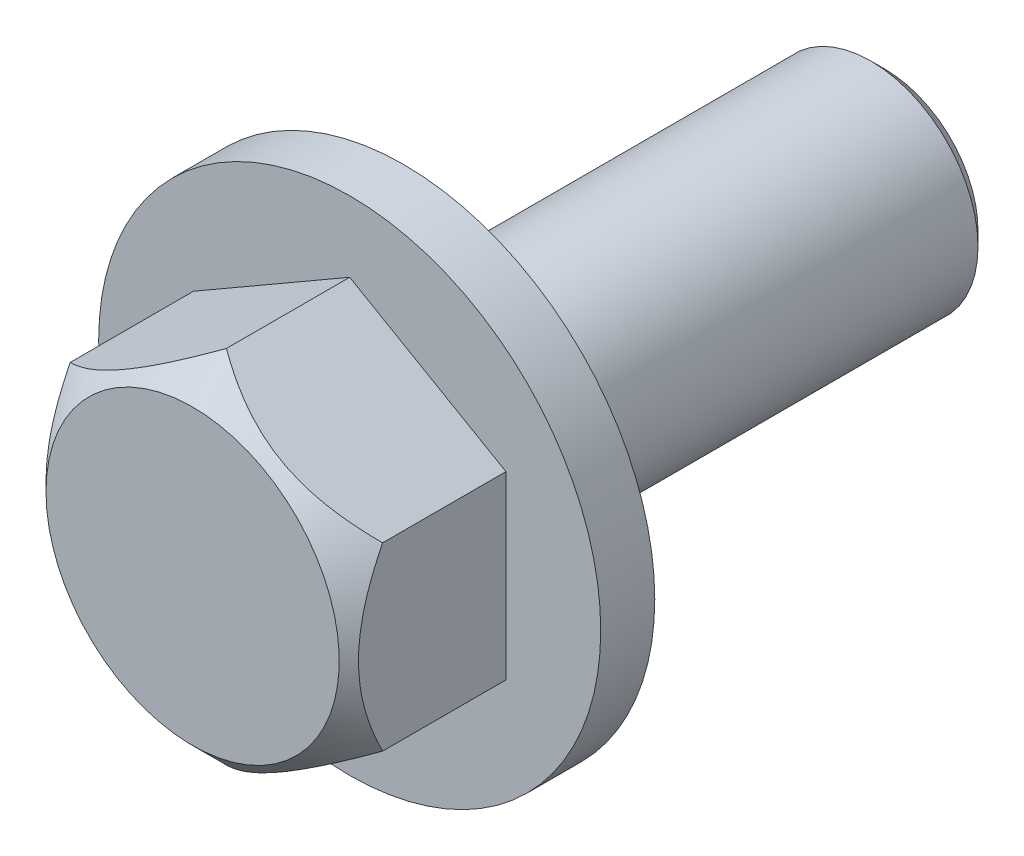
ISO-10303-21;
HEADER;
FILE_DESCRIPTION(('STEP AP214'),'2;1');
FILE_NAME('part.step','',(''),(''),'','','');
FILE_SCHEMA(('AUTOMOTIVE_DESIGN { 1 0 10303 214 1 1 1 1 }'));
ENDSEC;
DATA;
#1=APPLICATION_CONTEXT('core data for automotive mechanical design processes');
#2=APPLICATION_PROTOCOL_DEFINITION('international standard','automotive_design',2000,#1);
#3=PRODUCT_CONTEXT('',#1,'mechanical');
#4=PRODUCT('Part','Part','',(#3));
#5=PRODUCT_RELATED_PRODUCT_CATEGORY('part','',(#4));
#6=PRODUCT_DEFINITION_FORMATION('','',#4);
#7=PRODUCT_DEFINITION_CONTEXT('part definition',#1,'design');
#8=PRODUCT_DEFINITION('design','',#6,#7);
#9=PRODUCT_DEFINITION_SHAPE('','',#8);
#10=(LENGTH_UNIT() NAMED_UNIT(*) SI_UNIT(.MILLI.,.METRE.));
#11=(NAMED_UNIT(*) PLANE_ANGLE_UNIT() SI_UNIT($,.RADIAN.));
#12=(NAMED_UNIT(*) SI_UNIT($,.STERADIAN.) SOLID_ANGLE_UNIT());
#13=UNCERTAINTY_MEASURE_WITH_UNIT(LENGTH_MEASURE(1.E-05),#10,'distance_accuracy_value','');
#14=(GEOMETRIC_REPRESENTATION_CONTEXT(3) GLOBAL_UNCERTAINTY_ASSIGNED_CONTEXT((#13)) GLOBAL_UNIT_ASSIGNED_CONTEXT((#10,
#11,#12)) REPRESENTATION_CONTEXT('',''));
#15=CARTESIAN_POINT('',(0.,0.,0.));
#16=DIRECTION('',(0.,0.,1.));
#17=DIRECTION('',(1.,0.,0.));
#18=AXIS2_PLACEMENT_3D('',#15,#16,#17);
#19=CARTESIAN_POINT('',(9.25,5.34048999000404,9.3));
#20=DIRECTION('',(-0.5,-0.866025403784439,0.));
#21=DIRECTION('',(0.866025403784439,-0.5,0.));
#22=AXIS2_PLACEMENT_3D('',#19,#20,#21);
#23=PLANE('',#22);
#24=DIRECTION('',(0.,0.,-1.));
#25=VECTOR('',#24,1.);
#26=CARTESIAN_POINT('',(0.,10.6809799800081,9.3));
#27=LINE('',#26,#25);
#28=CARTESIAN_POINT('',(0.,10.6809799800081,7.3));
#29=VERTEX_POINT('',#28);
#30=CARTESIAN_POINT('',(0.,10.6809799800081,0.));
#31=VERTEX_POINT('',#30);
#32=EDGE_CURVE('E11',#29,#31,#27,.T.);
#33=ORIENTED_EDGE('',*,*,#32,.F.);
#34=CARTESIAN_POINT('',(-0.000199999999999625,10.6810954500619,7.2998845280737));
#35=CARTESIAN_POINT('',(0.158829174706491,10.5892799132361,7.39168718876653));
#36=CARTESIAN_POINT('',(0.31910380653289,10.4967453114069,7.48068854532498));
#37=CARTESIAN_POINT('',(0.642337852399902,10.3101260480143,7.65219880633447));
#38=CARTESIAN_POINT('',(0.805298674777847,10.216040573347,7.73470416502706));
#39=CARTESIAN_POINT('',(1.1348676092499,10.0257638603131,7.89268200351056));
#40=CARTESIAN_POINT('',(1.30149126236441,9.92956364933404,7.96811150950248));
#41=CARTESIAN_POINT('',(1.63747531263137,9.73558316746899,8.11029937459871));
#42=CARTESIAN_POINT('',(1.80683528690596,9.63780314073161,8.17705905941547));
#43=CARTESIAN_POINT('',(2.14556892319104,9.44223518463884,8.29979498305546));
#44=CARTESIAN_POINT('',(2.31490095825739,9.34447128861085,8.35592352165215));
#45=CARTESIAN_POINT('',(2.65593877344325,9.14757301420945,8.45753910479698));
#46=CARTESIAN_POINT('',(2.82764429589576,9.04843878460015,8.50302729500586));
#47=CARTESIAN_POINT('',(3.17269464729332,8.8492238713368,8.58221696358148));
#48=CARTESIAN_POINT('',(3.34603486826237,8.74914584809893,8.6159449728134));
#49=CARTESIAN_POINT('',(3.69417056108437,8.54814961213363,8.67087314748344));
#50=CARTESIAN_POINT('',(3.86896581151441,8.44723152724478,8.69207518498653));
#51=CARTESIAN_POINT('',(4.29492619104381,8.20130318745936,8.72762496747268));
#52=CARTESIAN_POINT('',(4.54655172248353,8.05602711914766,8.73508511778484));
#53=CARTESIAN_POINT('',(5.04934771228823,7.76573771908645,8.72256376339598));
#54=CARTESIAN_POINT('',(5.30051798024096,7.62072449727151,8.70257263961371));
#55=CARTESIAN_POINT('',(5.80049086438446,7.33206501802375,8.63632872486491));
#56=CARTESIAN_POINT('',(6.0492905161681,7.18842047209218,8.59004656765804));
#57=CARTESIAN_POINT('',(6.5426134329192,6.90360035330852,8.4737363370328));
#58=CARTESIAN_POINT('',(6.78713702430313,6.76242459199979,8.403710084533));
#59=CARTESIAN_POINT('',(7.22120022201972,6.51181808795281,8.25964812915158));
#60=CARTESIAN_POINT('',(7.41170116585497,6.40183231674865,8.18940192943167));
#61=CARTESIAN_POINT('',(7.78928351087732,6.18383504820875,8.03759012684629));
#62=CARTESIAN_POINT('',(7.97636480837184,6.07582361073994,7.95602418137893));
#63=CARTESIAN_POINT('',(8.34651860826112,5.8621152147323,7.7834011605929));
#64=CARTESIAN_POINT('',(8.52960163781837,5.75641217833337,7.69237393377003));
#65=CARTESIAN_POINT('',(8.89237769430114,5.54696332446749,7.50202330421582));
#66=CARTESIAN_POINT('',(9.07207271807039,5.44321635412228,7.40270498823749));
#67=CARTESIAN_POINT('',(9.25019999999999,5.3403745199502,7.2998845280737));
#68=B_SPLINE_CURVE_WITH_KNOTS('',3,(#34,#35,#36,#37,#38,#39,#40,#41,#42,#43,#44,#45,#46,#47,#48,
#49,#50,#51,#52,#53,#54,#55,#56,#57,#58,#59,#60,#61,#62,#63,#64,#65,#66,#67),.UNSPECIFIED.,.F.,
.F.,(4,2,2,2,2,2,2,2,2,2,2,2,2,2,2,2,4),(0.,0.615926148952828,1.23218619568639,1.85197482577676,
2.47166857139587,3.08167196465218,3.69160964775171,4.3001622758662,4.90862392992529,
5.77920863985932,6.6500984854427,7.52196300514645,8.39376067726823,9.08618244548536,
9.77862517501767,10.468946126611,11.1588466217033),.UNSPECIFIED.);
#69=CARTESIAN_POINT('',(9.25,5.34048999000405,7.3));
#70=VERTEX_POINT('',#69);
#71=EDGE_CURVE('E116',#29,#70,#68,.T.);
#72=ORIENTED_EDGE('',*,*,#71,.T.);
#73=DIRECTION('',(0.,0.,-1.));
#74=VECTOR('',#73,1.);
#75=CARTESIAN_POINT('',(9.25,5.34048999000404,9.3));
#76=LINE('',#75,#74);
#77=CARTESIAN_POINT('',(9.25,5.34048999000404,0.));
#78=VERTEX_POINT('',#77);
#79=EDGE_CURVE('E113',#70,#78,#76,.T.);
#80=ORIENTED_EDGE('',*,*,#79,.T.);
#81=DIRECTION('',(-0.866025403784439,0.5,0.));
#82=VECTOR('',#81,1.);
#83=CARTESIAN_POINT('',(9.25,5.34048999000404,0.));
#84=LINE('',#83,#82);
#85=EDGE_CURVE('E100',#78,#31,#84,.T.);
#86=ORIENTED_EDGE('',*,*,#85,.T.);
#87=EDGE_LOOP('',(#33,#72,#80,#86));
#88=FACE_BOUND('',#87,.T.);
#89=ADVANCED_FACE('F45',(#88),#23,.F.);
#90=CARTESIAN_POINT('',(0.,10.6809799800081,9.3));
#91=DIRECTION('',(0.5,-0.866025403784439,0.));
#92=DIRECTION('',(0.866025403784439,0.5,0.));
#93=AXIS2_PLACEMENT_3D('',#90,#91,#92);
#94=PLANE('',#93);
#95=DIRECTION('',(0.,0.,-1.));
#96=VECTOR('',#95,1.);
#97=CARTESIAN_POINT('',(-9.25,5.34048999000404,9.3));
#98=LINE('',#97,#96);
#99=CARTESIAN_POINT('',(-9.25,5.34048999000404,7.3));
#100=VERTEX_POINT('',#99);
#101=CARTESIAN_POINT('',(-9.25,5.34048999000404,0.));
#102=VERTEX_POINT('',#101);
#103=EDGE_CURVE('E54',#100,#102,#98,.T.);
#104=ORIENTED_EDGE('',*,*,#103,.F.);
#105=CARTESIAN_POINT('',(-9.2502,5.3403745199502,7.2998845280737));
#106=CARTESIAN_POINT('',(-9.09117082529351,5.432190056776,7.39168718876653));
#107=CARTESIAN_POINT('',(-8.93089619346711,5.52472465860524,7.48068854532498));
#108=CARTESIAN_POINT('',(-8.6076621476001,5.71134392199781,7.65219880633446));
#109=CARTESIAN_POINT('',(-8.44470132522216,5.80542939666508,7.73470416502706));
#110=CARTESIAN_POINT('',(-8.1151323907501,5.99570610969906,7.89268200351056));
#111=CARTESIAN_POINT('',(-7.94850873763559,6.09190632067808,7.96811150950248));
#112=CARTESIAN_POINT('',(-7.61252468736863,6.28588680254313,8.11029937459871));
#113=CARTESIAN_POINT('',(-7.44316471309404,6.38366682928051,8.17705905941547));
#114=CARTESIAN_POINT('',(-7.10443107680896,6.57923478537329,8.29979498305546));
#115=CARTESIAN_POINT('',(-6.93509904174261,6.67699868140127,8.35592352165215));
#116=CARTESIAN_POINT('',(-6.59406122655675,6.87389695580267,8.45753910479698));
#117=CARTESIAN_POINT('',(-6.42235570410425,6.97303118541197,8.50302729500586));
#118=CARTESIAN_POINT('',(-6.07730535270669,7.17224609867532,8.58221696358148));
#119=CARTESIAN_POINT('',(-5.90396513173763,7.27232412191319,8.6159449728134));
#120=CARTESIAN_POINT('',(-5.55582943891564,7.47332035787849,8.67087314748344));
#121=CARTESIAN_POINT('',(-5.3810341884856,7.57423844276734,8.69207518498653));
#122=CARTESIAN_POINT('',(-4.95507380895619,7.82016678255276,8.72762496747268));
#123=CARTESIAN_POINT('',(-4.70344827751648,7.96544285086446,8.73508511778484));
#124=CARTESIAN_POINT('',(-4.20065228771177,8.25573225092567,8.72256376339598));
#125=CARTESIAN_POINT('',(-3.94948201975904,8.40074547274061,8.70257263961371));
#126=CARTESIAN_POINT('',(-3.44950913561555,8.68940495198837,8.63632872486491));
#127=CARTESIAN_POINT('',(-3.20070948383191,8.83304949791994,8.59004656765804));
#128=CARTESIAN_POINT('',(-2.7073865670808,9.1178696167036,8.4737363370328));
#129=CARTESIAN_POINT('',(-2.46286297569687,9.25904537801233,8.403710084533));
#130=CARTESIAN_POINT('',(-2.02879977798028,9.50965188205931,8.25964812915158));
#131=CARTESIAN_POINT('',(-1.83829883414503,9.61963765326347,8.18940192943167));
#132=CARTESIAN_POINT('',(-1.46071648912268,9.83763492180337,8.03759012684629));
#133=CARTESIAN_POINT('',(-1.27363519162816,9.94564635927218,7.95602418137893));
#134=CARTESIAN_POINT('',(-0.903481391738883,10.1593547552798,7.7834011605929));
#135=CARTESIAN_POINT('',(-0.720398362181624,10.2650577916788,7.69237393377002));
#136=CARTESIAN_POINT('',(-0.357622305698856,10.4745066455446,7.50202330421581));
#137=CARTESIAN_POINT('',(-0.1779272819296,10.5782536158898,7.40270498823749));
#138=CARTESIAN_POINT('',(0.000200000000000077,10.6810954500619,7.2998845280737));
#139=B_SPLINE_CURVE_WITH_KNOTS('',3,(#105,#106,#107,#108,#109,#110,#111,#112,#113,#114,#115,
#116,#117,#118,#119,#120,#121,#122,#123,#124,#125,#126,#127,#128,#129,#130,#131,#132,#133,#134,
#135,#136,#137,#138),.UNSPECIFIED.,.F.,.F.,(4,2,2,2,2,2,2,2,2,2,2,2,2,2,2,2,4),(0.,
0.615926148952828,1.23218619568639,1.85197482577676,2.47166857139587,3.08167196465217,
3.69160964775171,4.3001622758662,4.90862392992529,5.77920863985932,6.6500984854427,
7.52196300514645,8.39376067726822,9.08618244548536,9.77862517501767,10.468946126611,
11.1588466217033),.UNSPECIFIED.);
#140=EDGE_CURVE('E109',#100,#29,#139,.T.);
#141=ORIENTED_EDGE('',*,*,#140,.T.);
#142=ORIENTED_EDGE('',*,*,#32,.T.);
#143=DIRECTION('',(-0.866025403784439,-0.5,0.));
#144=VECTOR('',#143,1.);
#145=CARTESIAN_POINT('',(0.,10.6809799800081,0.));
#146=LINE('',#145,#144);
#147=EDGE_CURVE('E97',#31,#102,#146,.T.);
#148=ORIENTED_EDGE('',*,*,#147,.T.);
#149=EDGE_LOOP('',(#104,#141,#142,#148));
#150=FACE_BOUND('',#149,.T.);
#151=ADVANCED_FACE('F108',(#150),#94,.F.);
#152=CARTESIAN_POINT('',(-9.25,5.34048999000404,9.3));
#153=DIRECTION('',(1.,0.,0.));
#154=DIRECTION('',(0.,0.,-1.));
#155=AXIS2_PLACEMENT_3D('',#152,#153,#154);
#156=PLANE('',#155);
#157=DIRECTION('',(0.,0.,-1.));
#158=VECTOR('',#157,1.);
#159=CARTESIAN_POINT('',(-9.25,-5.34048999000404,9.3));
#160=LINE('',#159,#158);
#161=CARTESIAN_POINT('',(-9.25000000000001,-5.34048999000403,7.3));
#162=VERTEX_POINT('',#161);
#163=CARTESIAN_POINT('',(-9.25,-5.34048999000404,0.));
#164=VERTEX_POINT('',#163);
#165=EDGE_CURVE('E150',#162,#164,#160,.T.);
#166=ORIENTED_EDGE('',*,*,#165,.F.);
#167=CARTESIAN_POINT('',(-9.25,-16.2073055318061,-0.680189667184761));
#168=CARTESIAN_POINT('',(-9.25,-15.9678781635089,-0.472253907223798));
#169=CARTESIAN_POINT('',(-9.25,-15.7278971183755,-0.26495385584864));
#170=CARTESIAN_POINT('',(-9.25,-15.2466782313579,0.148189918080403));
#171=CARTESIAN_POINT('',(-9.25,-15.0054403690818,0.354033616876432));
#172=CARTESIAN_POINT('',(-9.25,-14.5214529988361,0.764168911445474));
#173=CARTESIAN_POINT('',(-9.25,-14.2787028364467,0.968459736012183));
#174=CARTESIAN_POINT('',(-9.25,-13.7916274961275,1.37515039865911));
#175=CARTESIAN_POINT('',(-9.25,-13.5473023236523,1.57755024328223));
#176=CARTESIAN_POINT('',(-9.25,-12.8005838203051,2.19063279169253));
#177=CARTESIAN_POINT('',(-9.25,-12.2953670858196,2.59790405249156));
#178=CARTESIAN_POINT('',(-9.25,-11.5304149451627,3.19962780711811));
#179=CARTESIAN_POINT('',(-9.25,-11.2742709885391,3.39865095886895));
#180=CARTESIAN_POINT('',(-9.25,-10.7592285502089,3.79309694204307));
#181=CARTESIAN_POINT('',(-9.25,-10.5003301254475,3.98851984766949));
#182=CARTESIAN_POINT('',(-9.25,-9.97902261866833,4.37536248409406));
#183=CARTESIAN_POINT('',(-9.25,-9.71660934357748,4.5667765740283));
#184=CARTESIAN_POINT('',(-9.25,-9.1881196213626,4.94449762480108));
#185=CARTESIAN_POINT('',(-9.25,-8.9220431333944,5.13080452862603));
#186=CARTESIAN_POINT('',(-9.25,-8.38543327589617,5.49740838334697));
#187=CARTESIAN_POINT('',(-9.25,-8.11489626573726,5.67770002076558));
#188=CARTESIAN_POINT('',(-9.25,-7.56894083367665,6.03074996315882));
#189=CARTESIAN_POINT('',(-9.25,-7.2935225180259,6.20350843182473));
#190=CARTESIAN_POINT('',(-9.25,-6.73913234468851,6.53851612943586));
#191=CARTESIAN_POINT('',(-9.25,-6.46020211403959,6.70083392546014));
#192=CARTESIAN_POINT('',(-9.25,-5.89599970411699,7.01419987915472));
#193=CARTESIAN_POINT('',(-9.25,-5.61072676547328,7.16524667789082));
#194=CARTESIAN_POINT('',(-9.25,-5.03354697801002,7.45308277139695));
#195=CARTESIAN_POINT('',(-9.25,-4.74165053762485,7.58989277248187));
#196=CARTESIAN_POINT('',(-9.25,-4.15035077340609,7.8460425533049));
#197=CARTESIAN_POINT('',(-9.25,-3.85095040744964,7.96538909372906));
#198=CARTESIAN_POINT('',(-9.25,-3.2374254237705,8.18508346654685));
#199=CARTESIAN_POINT('',(-9.25,-2.92312070330237,8.28493539540141));
#200=CARTESIAN_POINT('',(-9.25,-2.28704102416632,8.45735273669191));
#201=CARTESIAN_POINT('',(-9.25,-1.96526726488772,8.52992249839215));
#202=CARTESIAN_POINT('',(-9.25,-1.31811878474162,8.64292843139992));
#203=CARTESIAN_POINT('',(-9.25,-0.99277987050432,8.68356558593655));
#204=CARTESIAN_POINT('',(-9.25,-0.339614584822018,8.73047602830894));
#205=CARTESIAN_POINT('',(-9.25,-0.0117884990894294,8.73675320512128));
#206=CARTESIAN_POINT('',(-9.25,0.643191163849383,8.71443505549477));
#207=CARTESIAN_POINT('',(-9.25,0.970342728516824,8.68578196584632));
#208=CARTESIAN_POINT('',(-9.25,1.62006883717423,8.59570069779901));
#209=CARTESIAN_POINT('',(-9.25,1.94264244954199,8.53426594373296));
#210=CARTESIAN_POINT('',(-9.25,2.58315376881699,8.38214796154838));
#211=CARTESIAN_POINT('',(-9.25,2.90104121716928,8.29125684718009));
#212=CARTESIAN_POINT('',(-9.25,3.52872539094528,8.08520085743839));
#213=CARTESIAN_POINT('',(-9.25,3.8385219800585,7.97003557340283));
#214=CARTESIAN_POINT('',(-9.25,4.51609593501326,7.69300925678571));
#215=CARTESIAN_POINT('',(-9.25,4.88192980176048,7.52643564017339));
#216=CARTESIAN_POINT('',(-9.25,5.60272397140079,7.17104772927229));
#217=CARTESIAN_POINT('',(-9.25,5.95767788205081,6.98222066459669));
#218=CARTESIAN_POINT('',(-9.25,6.65870649250263,6.58725943151925));
#219=CARTESIAN_POINT('',(-9.25,7.00476140403262,6.38109042647131));
#220=CARTESIAN_POINT('',(-9.25,7.68863864749029,5.95575567042267));
#221=CARTESIAN_POINT('',(-9.25,8.02646258620044,5.73659248518852));
#222=CARTESIAN_POINT('',(-9.25,8.69706988954528,5.28691248989398));
#223=CARTESIAN_POINT('',(-9.25,9.02981641353877,5.05634099871681));
#224=CARTESIAN_POINT('',(-9.25,9.68954518769363,4.58709888973573));
#225=CARTESIAN_POINT('',(-9.25,10.0165272305575,4.34842798156636));
#226=CARTESIAN_POINT('',(-9.25,10.6652807103912,3.86488913752069));
#227=CARTESIAN_POINT('',(-9.25,10.9870576877872,3.62002861462481));
#228=CARTESIAN_POINT('',(-9.25,11.626542664597,3.12507112913887));
#229=CARTESIAN_POINT('',(-9.25,11.9442507209078,2.87497423989966));
#230=CARTESIAN_POINT('',(-9.25,12.5973397567391,2.35362435175602));
#231=CARTESIAN_POINT('',(-9.25,12.9324832396665,2.08207429434728));
#232=CARTESIAN_POINT('',(-9.25,13.5994689753693,1.53495579497064));
#233=CARTESIAN_POINT('',(-9.25,13.9313112275982,1.25938735233774));
#234=CARTESIAN_POINT('',(-9.25,14.5885335099744,0.707991550819635));
#235=CARTESIAN_POINT('',(-9.25,14.9139443985055,0.432200919496248));
#236=CARTESIAN_POINT('',(-9.25,15.5623349577208,-0.122079667516844));
#237=CARTESIAN_POINT('',(-9.25,15.8853151531877,-0.400569009019293));
#238=CARTESIAN_POINT('',(-9.25,16.2073055318061,-0.680189667184767));
#239=B_SPLINE_CURVE_WITH_KNOTS('',3,(#167,#168,#169,#170,#171,#172,#173,#174,#175,#176,#177,
#178,#179,#180,#181,#182,#183,#184,#185,#186,#187,#188,#189,#190,#191,#192,#193,#194,#195,#196,
#197,#198,#199,#200,#201,#202,#203,#204,#205,#206,#207,#208,#209,#210,#211,#212,#213,#214,#215,
#216,#217,#218,#219,#220,#221,#222,#223,#224,#225,#226,#227,#228,#229,#230,#231,#232,#233,#234,
#235,#236,#237,#238),.UNSPECIFIED.,.F.,.F.,(4,2,2,2,2,2,2,2,2,2,2,2,2,2,2,2,2,2,2,2,2,2,2,2,2,2,
2,2,2,2,2,2,2,2,2,4),(0.,0.95134936682352,1.90271421763447,2.85452416399449,3.80633081581425,
5.75295862793108,6.72606325135628,7.69914779604991,8.67352029327958,9.64790366340001,
10.6231260999126,11.5983273348509,12.5662803021357,13.5343497867131,14.5009910101004,
15.4672570188103,16.4555812424731,17.4437478427394,18.4256439818353,19.4074289843617,
20.3908397421021,21.3744478361953,22.365154624603,23.3558780931577,24.5607737342995,
25.7663642162179,26.9744371437454,28.1822723204906,29.396597885687,30.6109670307448,
31.8239449163693,33.0369058219907,34.3309100547464,35.6249145016516,36.904575642892,
38.1839520893549),.UNSPECIFIED.);
#240=EDGE_CURVE('E158',#162,#100,#239,.T.);
#241=ORIENTED_EDGE('',*,*,#240,.T.);
#242=ORIENTED_EDGE('',*,*,#103,.T.);
#243=DIRECTION('',(0.,-1.,0.));
#244=VECTOR('',#243,1.);
#245=CARTESIAN_POINT('',(-9.25,5.34048999000404,0.));
#246=LINE('',#245,#244);
#247=EDGE_CURVE('E69',#102,#164,#246,.T.);
#248=ORIENTED_EDGE('',*,*,#247,.T.);
#249=EDGE_LOOP('',(#166,#241,#242,#248));
#250=FACE_BOUND('',#249,.T.);
#251=ADVANCED_FACE('F157',(#250),#156,.F.);
#252=CARTESIAN_POINT('',(-9.25,-5.34048999000404,9.3));
#253=DIRECTION('',(0.5,0.866025403784439,0.));
#254=DIRECTION('',(-0.866025403784439,0.5,0.));
#255=AXIS2_PLACEMENT_3D('',#252,#253,#254);
#256=PLANE('',#255);
#257=DIRECTION('',(0.,0.,-1.));
#258=VECTOR('',#257,1.);
#259=CARTESIAN_POINT('',(0.,-10.6809799800081,9.3));
#260=LINE('',#259,#258);
#261=CARTESIAN_POINT('',(0.,-10.6809799800081,7.3));
#262=VERTEX_POINT('',#261);
#263=CARTESIAN_POINT('',(0.,-10.6809799800081,0.));
#264=VERTEX_POINT('',#263);
#265=EDGE_CURVE('E146',#262,#264,#260,.T.);
#266=ORIENTED_EDGE('',*,*,#265,.F.);
#267=CARTESIAN_POINT('',(0.000200000000000601,-10.6810954500619,7.2998845280737));
#268=CARTESIAN_POINT('',(-0.158829174706488,-10.5892799132361,7.39168718876653));
#269=CARTESIAN_POINT('',(-0.319103806532886,-10.4967453114069,7.48068854532499));
#270=CARTESIAN_POINT('',(-0.6423378523999,-10.3101260480143,7.65219880633447));
#271=CARTESIAN_POINT('',(-0.805298674777846,-10.216040573347,7.73470416502707));
#272=CARTESIAN_POINT('',(-1.1348676092499,-10.0257638603131,7.89268200351056));
#273=CARTESIAN_POINT('',(-1.30149126236441,-9.92956364933404,7.96811150950248));
#274=CARTESIAN_POINT('',(-1.63747531263137,-9.73558316746899,8.11029937459871));
#275=CARTESIAN_POINT('',(-1.80683528690596,-9.63780314073161,8.17705905941547));
#276=CARTESIAN_POINT('',(-2.14556892319104,-9.44223518463883,8.29979498305546));
#277=CARTESIAN_POINT('',(-2.31490095825739,-9.34447128861085,8.35592352165215));
#278=CARTESIAN_POINT('',(-2.65593877344325,-9.14757301420945,8.45753910479698));
#279=CARTESIAN_POINT('',(-2.82764429589576,-9.04843878460015,8.50302729500587));
#280=CARTESIAN_POINT('',(-3.17269464729332,-8.8492238713368,8.58221696358149));
#281=CARTESIAN_POINT('',(-3.34603486826237,-8.74914584809892,8.6159449728134));
#282=CARTESIAN_POINT('',(-3.69417056108437,-8.54814961213363,8.67087314748344));
#283=CARTESIAN_POINT('',(-3.8689658115144,-8.44723152724477,8.69207518498653));
#284=CARTESIAN_POINT('',(-4.29492619104381,-8.20130318745936,8.72762496747268));
#285=CARTESIAN_POINT('',(-4.54655172248353,-8.05602711914766,8.73508511778484));
#286=CARTESIAN_POINT('',(-5.04934771228823,-7.76573771908645,8.72256376339599));
#287=CARTESIAN_POINT('',(-5.30051798024096,-7.62072449727151,8.70257263961371));
#288=CARTESIAN_POINT('',(-5.80049086438446,-7.33206501802375,8.63632872486491));
#289=CARTESIAN_POINT('',(-6.0492905161681,-7.18842047209217,8.59004656765804));
#290=CARTESIAN_POINT('',(-6.5426134329192,-6.90360035330851,8.4737363370328));
#291=CARTESIAN_POINT('',(-6.78713702430313,-6.76242459199979,8.403710084533));
#292=CARTESIAN_POINT('',(-7.22120022201972,-6.5118180879528,8.25964812915158));
#293=CARTESIAN_POINT('',(-7.41170116585497,-6.40183231674864,8.18940192943167));
#294=CARTESIAN_POINT('',(-7.78928351087732,-6.18383504820874,8.03759012684629));
#295=CARTESIAN_POINT('',(-7.97636480837184,-6.07582361073994,7.95602418137893));
#296=CARTESIAN_POINT('',(-8.34651860826112,-5.8621152147323,7.78340116059291));
#297=CARTESIAN_POINT('',(-8.52960163781838,-5.75641217833336,7.69237393377003));
#298=CARTESIAN_POINT('',(-8.89237769430115,-5.54696332446749,7.50202330421582));
#299=CARTESIAN_POINT('',(-9.0720727180704,-5.44321635412227,7.40270498823749));
#300=CARTESIAN_POINT('',(-9.2502,-5.3403745199502,7.2998845280737));
#301=B_SPLINE_CURVE_WITH_KNOTS('',3,(#267,#268,#269,#270,#271,#272,#273,#274,#275,#276,#277,
#278,#279,#280,#281,#282,#283,#284,#285,#286,#287,#288,#289,#290,#291,#292,#293,#294,#295,#296,
#297,#298,#299,#300),.UNSPECIFIED.,.F.,.F.,(4,2,2,2,2,2,2,2,2,2,2,2,2,2,2,2,4),(0.,
0.615926148952829,1.23218619568639,1.85197482577676,2.47166857139587,3.08167196465218,
3.69160964775171,4.3001622758662,4.90862392992529,5.77920863985933,6.6500984854427,
7.52196300514645,8.39376067726823,9.08618244548537,9.77862517501768,10.468946126611,
11.1588466217033),.UNSPECIFIED.);
#302=EDGE_CURVE('E161',#262,#162,#301,.T.);
#303=ORIENTED_EDGE('',*,*,#302,.T.);
#304=ORIENTED_EDGE('',*,*,#165,.T.);
#305=DIRECTION('',(0.866025403784438,-0.5,0.));
#306=VECTOR('',#305,1.);
#307=CARTESIAN_POINT('',(-9.25,-5.34048999000404,0.));
#308=LINE('',#307,#306);
#309=EDGE_CURVE('E129',#164,#264,#308,.T.);
#310=ORIENTED_EDGE('',*,*,#309,.T.);
#311=EDGE_LOOP('',(#266,#303,#304,#310));
#312=FACE_BOUND('',#311,.T.);
#313=ADVANCED_FACE('F213',(#312),#256,.F.);
#314=CARTESIAN_POINT('',(0.,-10.6809799800081,9.3));
#315=DIRECTION('',(-0.5,0.866025403784439,0.));
#316=DIRECTION('',(-0.866025403784439,-0.5,0.));
#317=AXIS2_PLACEMENT_3D('',#314,#315,#316);
#318=PLANE('',#317);
#319=DIRECTION('',(0.,0.,-1.));
#320=VECTOR('',#319,1.);
#321=CARTESIAN_POINT('',(9.25,-5.34048999000404,9.3));
#322=LINE('',#321,#320);
#323=CARTESIAN_POINT('',(9.25,-5.34048999000404,7.30000000000001));
#324=VERTEX_POINT('',#323);
#325=CARTESIAN_POINT('',(9.25,-5.34048999000404,0.));
#326=VERTEX_POINT('',#325);
#327=EDGE_CURVE('E142',#324,#326,#322,.T.);
#328=ORIENTED_EDGE('',*,*,#327,.F.);
#329=CARTESIAN_POINT('',(9.2502,-5.34037451995021,7.2998845280737));
#330=CARTESIAN_POINT('',(9.09117082529351,-5.432190056776,7.39168718876653));
#331=CARTESIAN_POINT('',(8.93089619346711,-5.52472465860524,7.48068854532499));
#332=CARTESIAN_POINT('',(8.60766214760009,-5.71134392199781,7.65219880633447));
#333=CARTESIAN_POINT('',(8.44470132522215,-5.80542939666508,7.73470416502707));
#334=CARTESIAN_POINT('',(8.11513239075009,-5.99570610969906,7.89268200351056));
#335=CARTESIAN_POINT('',(7.94850873763558,-6.09190632067808,7.96811150950248));
#336=CARTESIAN_POINT('',(7.61252468736862,-6.28588680254313,8.11029937459871));
#337=CARTESIAN_POINT('',(7.44316471309403,-6.38366682928052,8.17705905941547));
#338=CARTESIAN_POINT('',(7.10443107680895,-6.57923478537329,8.29979498305546));
#339=CARTESIAN_POINT('',(6.93509904174261,-6.67699868140127,8.35592352165215));
#340=CARTESIAN_POINT('',(6.59406122655674,-6.87389695580267,8.45753910479698));
#341=CARTESIAN_POINT('',(6.42235570410424,-6.97303118541197,8.50302729500586));
#342=CARTESIAN_POINT('',(6.07730535270668,-7.17224609867532,8.58221696358148));
#343=CARTESIAN_POINT('',(5.90396513173763,-7.27232412191319,8.6159449728134));
#344=CARTESIAN_POINT('',(5.55582943891563,-7.47332035787849,8.67087314748344));
#345=CARTESIAN_POINT('',(5.38103418848559,-7.57423844276734,8.69207518498653));
#346=CARTESIAN_POINT('',(4.95507380895619,-7.82016678255276,8.72762496747268));
#347=CARTESIAN_POINT('',(4.70344827751647,-7.96544285086446,8.73508511778484));
#348=CARTESIAN_POINT('',(4.20065228771177,-8.25573225092567,8.72256376339598));
#349=CARTESIAN_POINT('',(3.94948201975904,-8.40074547274061,8.70257263961371));
#350=CARTESIAN_POINT('',(3.44950913561555,-8.68940495198837,8.63632872486491));
#351=CARTESIAN_POINT('',(3.2007094838319,-8.83304949791994,8.59004656765804));
#352=CARTESIAN_POINT('',(2.7073865670808,-9.1178696167036,8.4737363370328));
#353=CARTESIAN_POINT('',(2.46286297569687,-9.25904537801233,8.403710084533));
#354=CARTESIAN_POINT('',(2.02879977798028,-9.50965188205931,8.25964812915158));
#355=CARTESIAN_POINT('',(1.83829883414503,-9.61963765326347,8.18940192943167));
#356=CARTESIAN_POINT('',(1.46071648912268,-9.83763492180337,8.03759012684629));
#357=CARTESIAN_POINT('',(1.27363519162816,-9.94564635927218,7.95602418137893));
#358=CARTESIAN_POINT('',(0.903481391738882,-10.1593547552798,7.7834011605929));
#359=CARTESIAN_POINT('',(0.720398362181623,-10.2650577916788,7.69237393377003));
#360=CARTESIAN_POINT('',(0.357622305698857,-10.4745066455446,7.50202330421581));
#361=CARTESIAN_POINT('',(0.177927281929601,-10.5782536158898,7.40270498823748));
#362=CARTESIAN_POINT('',(-0.000199999999999624,-10.6810954500619,7.2998845280737));
#363=B_SPLINE_CURVE_WITH_KNOTS('',3,(#329,#330,#331,#332,#333,#334,#335,#336,#337,#338,#339,
#340,#341,#342,#343,#344,#345,#346,#347,#348,#349,#350,#351,#352,#353,#354,#355,#356,#357,#358,
#359,#360,#361,#362),.UNSPECIFIED.,.F.,.F.,(4,2,2,2,2,2,2,2,2,2,2,2,2,2,2,2,4),(0.,
0.615926148952829,1.23218619568639,1.85197482577676,2.47166857139587,3.08167196465217,
3.6916096477517,4.3001622758662,4.90862392992529,5.77920863985932,6.65009848544269,
7.52196300514644,8.39376067726822,9.08618244548536,9.77862517501767,10.468946126611,
11.1588466217033),.UNSPECIFIED.);
#364=EDGE_CURVE('E61',#324,#262,#363,.T.);
#365=ORIENTED_EDGE('',*,*,#364,.T.);
#366=ORIENTED_EDGE('',*,*,#265,.T.);
#367=DIRECTION('',(0.866025403784439,0.5,0.));
#368=VECTOR('',#367,1.);
#369=CARTESIAN_POINT('',(0.,-10.6809799800081,0.));
#370=LINE('',#369,#368);
#371=EDGE_CURVE('E133',#264,#326,#370,.T.);
#372=ORIENTED_EDGE('',*,*,#371,.T.);
#373=EDGE_LOOP('',(#328,#365,#366,#372));
#374=FACE_BOUND('',#373,.T.);
#375=ADVANCED_FACE('F210',(#374),#318,.F.);
#376=CARTESIAN_POINT('',(9.25,-5.34048999000404,9.3));
#377=DIRECTION('',(-1.,0.,0.));
#378=DIRECTION('',(0.,0.,1.));
#379=AXIS2_PLACEMENT_3D('',#376,#377,#378);
#380=PLANE('',#379);
#381=ORIENTED_EDGE('',*,*,#79,.F.);
#382=CARTESIAN_POINT('',(9.25,16.2073055318061,-0.680189667184768));
#383=CARTESIAN_POINT('',(9.25,15.9678781635089,-0.472253907223803));
#384=CARTESIAN_POINT('',(9.25,15.7278971183755,-0.264953855848645));
#385=CARTESIAN_POINT('',(9.25,15.2466782313579,0.148189918080394));
#386=CARTESIAN_POINT('',(9.25,15.0054403690818,0.354033616876422));
#387=CARTESIAN_POINT('',(9.25,14.5214529988361,0.764168911445463));
#388=CARTESIAN_POINT('',(9.25,14.2787028364467,0.968459736012174));
#389=CARTESIAN_POINT('',(9.25,13.7916274961275,1.3751503986591));
#390=CARTESIAN_POINT('',(9.25,13.5473023236523,1.57755024328222));
#391=CARTESIAN_POINT('',(9.25,12.8005838203051,2.19063279169252));
#392=CARTESIAN_POINT('',(9.25,12.2953670858197,2.59790405249155));
#393=CARTESIAN_POINT('',(9.25,11.5304149451628,3.19962780711811));
#394=CARTESIAN_POINT('',(9.25,11.2742709885391,3.39865095886894));
#395=CARTESIAN_POINT('',(9.25,10.7592285502089,3.79309694204306));
#396=CARTESIAN_POINT('',(9.25,10.5003301254475,3.98851984766948));
#397=CARTESIAN_POINT('',(9.25,9.97902261866835,4.37536248409406));
#398=CARTESIAN_POINT('',(9.25,9.71660934357749,4.56677657402829));
#399=CARTESIAN_POINT('',(9.25,9.18811962136261,4.94449762480108));
#400=CARTESIAN_POINT('',(9.25,8.92204313339441,5.13080452862603));
#401=CARTESIAN_POINT('',(9.25,8.38543327589618,5.49740838334696));
#402=CARTESIAN_POINT('',(9.25,8.11489626573727,5.67770002076557));
#403=CARTESIAN_POINT('',(9.25,7.56894083367666,6.03074996315882));
#404=CARTESIAN_POINT('',(9.25,7.29352251802591,6.20350843182473));
#405=CARTESIAN_POINT('',(9.25,6.73913234468852,6.53851612943585));
#406=CARTESIAN_POINT('',(9.25,6.4602021140396,6.70083392546014));
#407=CARTESIAN_POINT('',(9.25,5.89599970411701,7.01419987915472));
#408=CARTESIAN_POINT('',(9.25,5.61072676547329,7.16524667789082));
#409=CARTESIAN_POINT('',(9.25,5.03354697801003,7.45308277139695));
#410=CARTESIAN_POINT('',(9.25,4.74165053762486,7.58989277248187));
#411=CARTESIAN_POINT('',(9.25,4.1503507734061,7.8460425533049));
#412=CARTESIAN_POINT('',(9.25,3.85095040744965,7.96538909372906));
#413=CARTESIAN_POINT('',(9.25,3.23742542377051,8.18508346654685));
#414=CARTESIAN_POINT('',(9.25,2.92312070330238,8.28493539540141));
#415=CARTESIAN_POINT('',(9.25,2.28704102416633,8.45735273669192));
#416=CARTESIAN_POINT('',(9.25,1.96526726488773,8.52992249839215));
#417=CARTESIAN_POINT('',(9.25,1.31811878474162,8.64292843139992));
#418=CARTESIAN_POINT('',(9.25,0.992779870504329,8.68356558593656));
#419=CARTESIAN_POINT('',(9.25,0.339614584822027,8.73047602830895));
#420=CARTESIAN_POINT('',(9.25,0.0117884990894381,8.73675320512129));
#421=CARTESIAN_POINT('',(9.25,-0.643191163849374,8.71443505549478));
#422=CARTESIAN_POINT('',(9.25,-0.970342728516813,8.68578196584633));
#423=CARTESIAN_POINT('',(9.25,-1.62006883717422,8.59570069779902));
#424=CARTESIAN_POINT('',(9.25,-1.94264244954198,8.53426594373296));
#425=CARTESIAN_POINT('',(9.25,-2.58315376881698,8.38214796154838));
#426=CARTESIAN_POINT('',(9.25,-2.90104121716928,8.29125684718009));
#427=CARTESIAN_POINT('',(9.25,-3.52872539094528,8.0852008574384));
#428=CARTESIAN_POINT('',(9.25,-3.8385219800585,7.97003557340283));
#429=CARTESIAN_POINT('',(9.25,-4.51609593501325,7.69300925678571));
#430=CARTESIAN_POINT('',(9.25,-4.88192980176048,7.52643564017339));
#431=CARTESIAN_POINT('',(9.25,-5.60272397140078,7.1710477292723));
#432=CARTESIAN_POINT('',(9.25,-5.95767788205081,6.98222066459669));
#433=CARTESIAN_POINT('',(9.25,-6.65870649250262,6.58725943151926));
#434=CARTESIAN_POINT('',(9.25,-7.00476140403261,6.38109042647131));
#435=CARTESIAN_POINT('',(9.25,-7.68863864749028,5.95575567042267));
#436=CARTESIAN_POINT('',(9.25,-8.02646258620043,5.73659248518853));
#437=CARTESIAN_POINT('',(9.25,-8.69706988954527,5.28691248989399));
#438=CARTESIAN_POINT('',(9.25,-9.02981641353876,5.05634099871682));
#439=CARTESIAN_POINT('',(9.25,-9.68954518769361,4.58709888973575));
#440=CARTESIAN_POINT('',(9.25,-10.0165272305575,4.34842798156637));
#441=CARTESIAN_POINT('',(9.25,-10.6652807103912,3.8648891375207));
#442=CARTESIAN_POINT('',(9.25,-10.9870576877872,3.62002861462483));
#443=CARTESIAN_POINT('',(9.25,-11.626542664597,3.12507112913889));
#444=CARTESIAN_POINT('',(9.25,-11.9442507209077,2.87497423989968));
#445=CARTESIAN_POINT('',(9.25,-12.5973397567391,2.35362435175604));
#446=CARTESIAN_POINT('',(9.25,-12.9324832396665,2.08207429434729));
#447=CARTESIAN_POINT('',(9.25,-13.5994689753692,1.53495579497065));
#448=CARTESIAN_POINT('',(9.25,-13.9313112275982,1.25938735233775));
#449=CARTESIAN_POINT('',(9.25,-14.5885335099744,0.707991550819643));
#450=CARTESIAN_POINT('',(9.25,-14.9139443985055,0.432200919496252));
#451=CARTESIAN_POINT('',(9.25,-15.5623349577208,-0.122079667516846));
#452=CARTESIAN_POINT('',(9.25,-15.8853151531877,-0.400569009019297));
#453=CARTESIAN_POINT('',(9.25,-16.2073055318061,-0.68018966718477));
#454=B_SPLINE_CURVE_WITH_KNOTS('',3,(#382,#383,#384,#385,#386,#387,#388,#389,#390,#391,#392,
#393,#394,#395,#396,#397,#398,#399,#400,#401,#402,#403,#404,#405,#406,#407,#408,#409,#410,#411,
#412,#413,#414,#415,#416,#417,#418,#419,#420,#421,#422,#423,#424,#425,#426,#427,#428,#429,#430,
#431,#432,#433,#434,#435,#436,#437,#438,#439,#440,#441,#442,#443,#444,#445,#446,#447,#448,#449,
#450,#451,#452,#453),.UNSPECIFIED.,.F.,.F.,(4,2,2,2,2,2,2,2,2,2,2,2,2,2,2,2,2,2,2,2,2,2,2,2,2,2,
2,2,2,2,2,2,2,2,2,4),(0.,0.951349366823517,1.90271421763447,2.85452416399449,3.80633081581425,
5.75295862793108,6.72606325135629,7.69914779604991,8.67352029327958,9.64790366340002,
10.6231260999126,11.5983273348509,12.5662803021357,13.5343497867131,14.5009910101004,
15.4672570188103,16.4555812424731,17.4437478427394,18.4256439818353,19.4074289843617,
20.3908397421021,21.3744478361953,22.365154624603,23.3558780931577,24.5607737342995,
25.7663642162179,26.9744371437454,28.1822723204906,29.396597885687,30.6109670307448,
31.8239449163693,33.0369058219907,34.3309100547464,35.6249145016516,36.904575642892,
38.1839520893549),.UNSPECIFIED.);
#455=EDGE_CURVE('E195',#70,#324,#454,.T.);
#456=ORIENTED_EDGE('',*,*,#455,.T.);
#457=ORIENTED_EDGE('',*,*,#327,.T.);
#458=DIRECTION('',(0.,1.,0.));
#459=VECTOR('',#458,1.);
#460=CARTESIAN_POINT('',(9.25,-5.34048999000404,0.));
#461=LINE('',#460,#459);
#462=EDGE_CURVE('E137',#326,#78,#461,.T.);
#463=ORIENTED_EDGE('',*,*,#462,.T.);
#464=EDGE_LOOP('',(#381,#456,#457,#463));
#465=FACE_BOUND('',#464,.T.);
#466=ADVANCED_FACE('F188',(#465),#380,.F.);
#467=CARTESIAN_POINT('',(0.,0.,9.3));
#468=DIRECTION('',(0.,0.,-1.));
#469=DIRECTION('',(-1.,0.,0.));
#470=AXIS2_PLACEMENT_3D('',#467,#468,#469);
#471=CONICAL_SURFACE('',#470,8.68097998000808,0.785398163397448);
#472=CARTESIAN_POINT('',(0.,0.,9.3));
#473=DIRECTION('',(0.,0.,-1.));
#474=DIRECTION('',(-1.,0.,0.));
#475=AXIS2_PLACEMENT_3D('',#472,#473,#474);
#476=CIRCLE('',#475,8.68097998000808);
#477=CARTESIAN_POINT('',(-8.68097998000808,0.,9.3));
#478=VERTEX_POINT('',#477);
#479=EDGE_CURVE('E349',#478,#478,#476,.T.);
#480=ORIENTED_EDGE('',*,*,#479,.T.);
#481=EDGE_LOOP('',(#480));
#482=FACE_BOUND('',#481,.T.);
#483=ORIENTED_EDGE('',*,*,#140,.F.);
#484=ORIENTED_EDGE('',*,*,#240,.F.);
#485=ORIENTED_EDGE('',*,*,#302,.F.);
#486=ORIENTED_EDGE('',*,*,#364,.F.);
#487=ORIENTED_EDGE('',*,*,#455,.F.);
#488=ORIENTED_EDGE('',*,*,#71,.F.);
#489=EDGE_LOOP('',(#483,#484,#485,#486,#487,#488));
#490=FACE_BOUND('',#489,.T.);
#491=ADVANCED_FACE('F182',(#482,#490),#471,.T.);
#492=CARTESIAN_POINT('',(0.,0.,9.3));
#493=DIRECTION('',(0.,0.,1.));
#494=DIRECTION('',(1.,0.,0.));
#495=AXIS2_PLACEMENT_3D('',#492,#493,#494);
#496=PLANE('',#495);
#497=ORIENTED_EDGE('',*,*,#479,.F.);
#498=EDGE_LOOP('',(#497));
#499=FACE_BOUND('',#498,.T.);
#500=ADVANCED_FACE('F187',(#499),#496,.T.);
#501=CARTESIAN_POINT('',(0.,0.,0.));
#502=DIRECTION('',(0.,0.,1.));
#503=DIRECTION('',(0.,-1.,0.));
#504=AXIS2_PLACEMENT_3D('',#501,#502,#503);
#505=PLANE('',#504);
#506=CARTESIAN_POINT('',(0.,0.,0.));
#507=DIRECTION('',(0.,0.,-1.));
#508=DIRECTION('',(0.,1.,0.));
#509=AXIS2_PLACEMENT_3D('',#506,#507,#508);
#510=CIRCLE('',#509,14.8636947453888);
#511=CARTESIAN_POINT('',(0.,14.8636947453888,0.));
#512=VERTEX_POINT('',#511);
#513=EDGE_CURVE('E346',#512,#512,#510,.T.);
#514=ORIENTED_EDGE('',*,*,#513,.F.);
#515=EDGE_LOOP('',(#514));
#516=FACE_BOUND('',#515,.T.);
#517=ORIENTED_EDGE('',*,*,#85,.F.);
#518=ORIENTED_EDGE('',*,*,#462,.F.);
#519=ORIENTED_EDGE('',*,*,#371,.F.);
#520=ORIENTED_EDGE('',*,*,#309,.F.);
#521=ORIENTED_EDGE('',*,*,#247,.F.);
#522=ORIENTED_EDGE('',*,*,#147,.F.);
#523=EDGE_LOOP('',(#517,#518,#519,#520,#521,#522));
#524=FACE_BOUND('',#523,.T.);
#525=ADVANCED_FACE('F98',(#516,#524),#505,.T.);
#526=CARTESIAN_POINT('',(0.,0.,-31.7));
#527=DIRECTION('',(0.,0.,-1.));
#528=DIRECTION('',(0.,1.,0.));
#529=AXIS2_PLACEMENT_3D('',#526,#527,#528);
#530=CYLINDRICAL_SURFACE('',#529,14.8636947453888);
#531=ORIENTED_EDGE('',*,*,#513,.T.);
#532=EDGE_LOOP('',(#531));
#533=FACE_BOUND('',#532,.T.);
#534=CARTESIAN_POINT('',(0.,0.,-3.2));
#535=DIRECTION('',(0.,0.,-1.));
#536=DIRECTION('',(0.,1.,0.));
#537=AXIS2_PLACEMENT_3D('',#534,#535,#536);
#538=CIRCLE('',#537,14.8636947453888);
#539=CARTESIAN_POINT('',(0.,14.8636947453888,-3.2));
#540=VERTEX_POINT('',#539);
#541=EDGE_CURVE('E342',#540,#540,#538,.T.);
#542=ORIENTED_EDGE('',*,*,#541,.F.);
#543=EDGE_LOOP('',(#542));
#544=FACE_BOUND('',#543,.T.);
#545=ADVANCED_FACE('F276',(#533,#544),#530,.T.);
#546=CARTESIAN_POINT('',(0.,14.8636947453888,-3.2));
#547=DIRECTION('',(0.,0.,-1.));
#548=DIRECTION('',(0.,1.,0.));
#549=AXIS2_PLACEMENT_3D('',#546,#547,#548);
#550=PLANE('',#549);
#551=ORIENTED_EDGE('',*,*,#541,.T.);
#552=EDGE_LOOP('',(#551));
#553=FACE_BOUND('',#552,.T.);
#554=CARTESIAN_POINT('',(0.,0.,-3.2));
#555=DIRECTION('',(0.,0.,-1.));
#556=DIRECTION('',(0.,1.,0.));
#557=AXIS2_PLACEMENT_3D('',#554,#555,#556);
#558=CIRCLE('',#557,6.35);
#559=CARTESIAN_POINT('',(0.,6.35,-3.2));
#560=VERTEX_POINT('',#559);
#561=EDGE_CURVE('E336',#560,#560,#558,.T.);
#562=ORIENTED_EDGE('',*,*,#561,.F.);
#563=EDGE_LOOP('',(#562));
#564=FACE_BOUND('',#563,.T.);
#565=ADVANCED_FACE('F285',(#553,#564),#550,.T.);
#566=CARTESIAN_POINT('',(0.,0.,-31.7));
#567=DIRECTION('',(0.,0.,-1.));
#568=DIRECTION('',(0.,1.,0.));
#569=AXIS2_PLACEMENT_3D('',#566,#567,#568);
#570=CYLINDRICAL_SURFACE('',#569,6.35);
#571=ORIENTED_EDGE('',*,*,#561,.T.);
#572=EDGE_LOOP('',(#571));
#573=FACE_BOUND('',#572,.T.);
#574=CARTESIAN_POINT('',(0.,0.,-30.8514718625761));
#575=DIRECTION('',(0.,0.,-1.));
#576=DIRECTION('',(0.,1.,0.));
#577=AXIS2_PLACEMENT_3D('',#574,#575,#576);
#578=CIRCLE('',#577,6.35);
#579=CARTESIAN_POINT('',(0.,6.35,-30.8514718625761));
#580=VERTEX_POINT('',#579);
#581=EDGE_CURVE('E332',#580,#580,#578,.T.);
#582=ORIENTED_EDGE('',*,*,#581,.F.);
#583=EDGE_LOOP('',(#582));
#584=FACE_BOUND('',#583,.T.);
#585=ADVANCED_FACE('F294',(#573,#584),#570,.T.);
#586=CARTESIAN_POINT('',(0.,0.,-31.7));
#587=DIRECTION('',(0.,0.,1.));
#588=DIRECTION('',(0.,-1.,0.));
#589=AXIS2_PLACEMENT_3D('',#586,#587,#588);
#590=CONICAL_SURFACE('',#589,5.50147186257614,0.785398163397447);
#591=ORIENTED_EDGE('',*,*,#581,.T.);
#592=EDGE_LOOP('',(#591));
#593=FACE_BOUND('',#592,.T.);
#594=CARTESIAN_POINT('',(0.,0.,-31.7));
#595=DIRECTION('',(0.,0.,-1.));
#596=DIRECTION('',(0.,1.,0.));
#597=AXIS2_PLACEMENT_3D('',#594,#595,#596);
#598=CIRCLE('',#597,5.50147186257614);
#599=CARTESIAN_POINT('',(0.,5.50147186257614,-31.7));
#600=VERTEX_POINT('',#599);
#601=EDGE_CURVE('E329',#600,#600,#598,.T.);
#602=ORIENTED_EDGE('',*,*,#601,.F.);
#603=EDGE_LOOP('',(#602));
#604=FACE_BOUND('',#603,.T.);
#605=ADVANCED_FACE('F304',(#593,#604),#590,.T.);
#606=CARTESIAN_POINT('',(0.,5.50147186257614,-31.7));
#607=DIRECTION('',(0.,0.,-1.));
#608=DIRECTION('',(0.,1.,0.));
#609=AXIS2_PLACEMENT_3D('',#606,#607,#608);
#610=PLANE('',#609);
#611=ORIENTED_EDGE('',*,*,#601,.T.);
#612=EDGE_LOOP('',(#611));
#613=FACE_BOUND('',#612,.T.);
#614=ADVANCED_FACE('F314',(#613),#610,.T.);
#615=CLOSED_SHELL('',(#89,#151,#251,#313,#375,#466,#491,#500,#525,#545,#565,#585,#605,#614));
#616=MANIFOLD_SOLID_BREP('B2',#615);
#617=ADVANCED_BREP_SHAPE_REPRESENTATION('',(#18,#616),#14);
#618=SHAPE_DEFINITION_REPRESENTATION(#9,#617);
ENDSEC;
END-ISO-10303-21;
